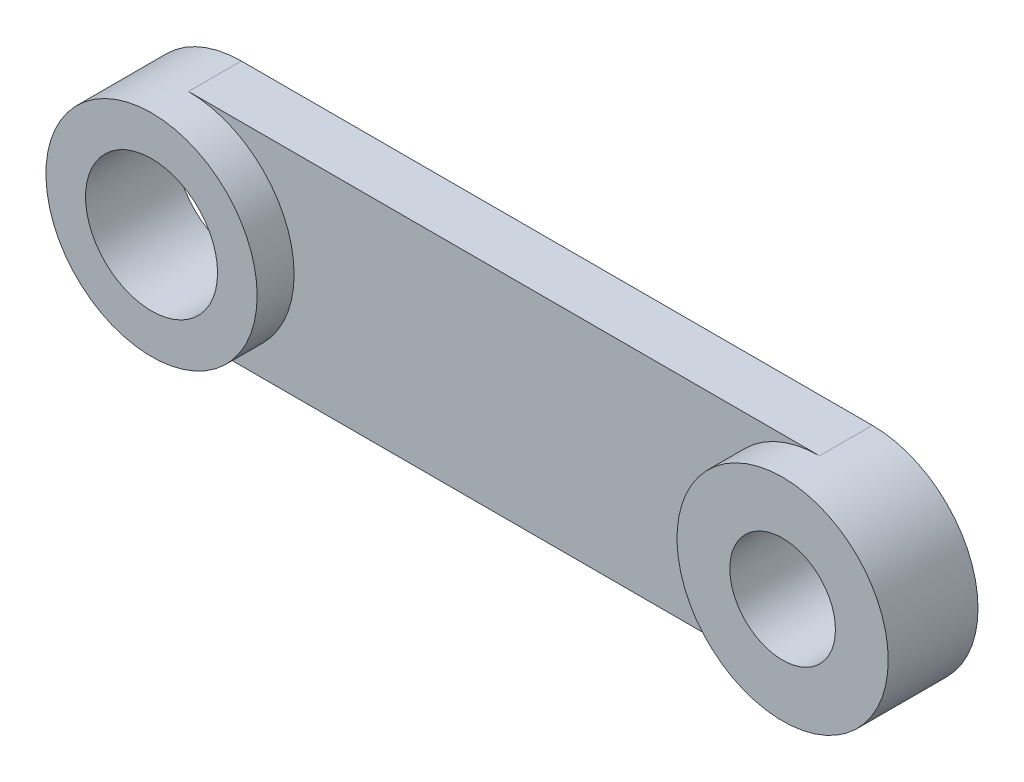
ISO-10303-21;
HEADER;
FILE_DESCRIPTION(('STEP AP214'),'2;1');
FILE_NAME('part.step','',(''),(''),'','','');
FILE_SCHEMA(('AUTOMOTIVE_DESIGN { 1 0 10303 214 1 1 1 1 }'));
ENDSEC;
DATA;
#1=APPLICATION_CONTEXT('core data for automotive mechanical design processes');
#2=APPLICATION_PROTOCOL_DEFINITION('international standard','automotive_design',2000,#1);
#3=PRODUCT_CONTEXT('',#1,'mechanical');
#4=PRODUCT('Part','Part','',(#3));
#5=PRODUCT_RELATED_PRODUCT_CATEGORY('part','',(#4));
#6=PRODUCT_DEFINITION_FORMATION('','',#4);
#7=PRODUCT_DEFINITION_CONTEXT('part definition',#1,'design');
#8=PRODUCT_DEFINITION('design','',#6,#7);
#9=PRODUCT_DEFINITION_SHAPE('','',#8);
#10=(LENGTH_UNIT() NAMED_UNIT(*) SI_UNIT(.MILLI.,.METRE.));
#11=(NAMED_UNIT(*) PLANE_ANGLE_UNIT() SI_UNIT($,.RADIAN.));
#12=(NAMED_UNIT(*) SI_UNIT($,.STERADIAN.) SOLID_ANGLE_UNIT());
#13=UNCERTAINTY_MEASURE_WITH_UNIT(LENGTH_MEASURE(1.E-05),#10,'distance_accuracy_value','');
#14=(GEOMETRIC_REPRESENTATION_CONTEXT(3) GLOBAL_UNCERTAINTY_ASSIGNED_CONTEXT((#13)) GLOBAL_UNIT_ASSIGNED_CONTEXT((#10,
#11,#12)) REPRESENTATION_CONTEXT('',''));
#15=CARTESIAN_POINT('',(0.,0.,0.));
#16=DIRECTION('',(0.,0.,1.));
#17=DIRECTION('',(1.,0.,0.));
#18=AXIS2_PLACEMENT_3D('',#15,#16,#17);
#19=CARTESIAN_POINT('',(-59.75,20.,10.));
#20=DIRECTION('',(0.,-1.,0.));
#21=DIRECTION('',(0.,0.,-1.));
#22=AXIS2_PLACEMENT_3D('',#19,#20,#21);
#23=PLANE('',#22);
#24=DIRECTION('',(-1.,0.,0.));
#25=VECTOR('',#24,1.);
#26=CARTESIAN_POINT('',(-59.75,20.,0.));
#27=LINE('',#26,#25);
#28=CARTESIAN_POINT('',(59.75,20.,0.));
#29=VERTEX_POINT('',#28);
#30=CARTESIAN_POINT('',(-59.75,20.,0.));
#31=VERTEX_POINT('',#30);
#32=EDGE_CURVE('E86',#29,#31,#27,.T.);
#33=ORIENTED_EDGE('',*,*,#32,.T.);
#34=DIRECTION('',(0.,0.,-1.));
#35=VECTOR('',#34,1.);
#36=CARTESIAN_POINT('',(-59.75,20.,10.));
#37=LINE('',#36,#35);
#38=CARTESIAN_POINT('',(-59.75,20.,10.));
#39=VERTEX_POINT('',#38);
#40=EDGE_CURVE('E48',#39,#31,#37,.T.);
#41=ORIENTED_EDGE('',*,*,#40,.F.);
#42=DIRECTION('',(-1.,0.,0.));
#43=VECTOR('',#42,1.);
#44=CARTESIAN_POINT('',(-59.75,20.,10.));
#45=LINE('',#44,#43);
#46=CARTESIAN_POINT('',(59.75,20.,10.));
#47=VERTEX_POINT('',#46);
#48=EDGE_CURVE('E85',#47,#39,#45,.T.);
#49=ORIENTED_EDGE('',*,*,#48,.F.);
#50=DIRECTION('',(0.,0.,-1.));
#51=VECTOR('',#50,1.);
#52=CARTESIAN_POINT('',(59.75,20.,10.));
#53=LINE('',#52,#51);
#54=EDGE_CURVE('E11',#47,#29,#53,.T.);
#55=ORIENTED_EDGE('',*,*,#54,.T.);
#56=EDGE_LOOP('',(#33,#41,#49,#55));
#57=FACE_BOUND('',#56,.T.);
#58=ADVANCED_FACE('F39',(#57),#23,.F.);
#59=CARTESIAN_POINT('',(-59.75,-20.,10.));
#60=DIRECTION('',(0.,1.,0.));
#61=DIRECTION('',(0.,0.,1.));
#62=AXIS2_PLACEMENT_3D('',#59,#60,#61);
#63=PLANE('',#62);
#64=DIRECTION('',(1.,0.,0.));
#65=VECTOR('',#64,1.);
#66=CARTESIAN_POINT('',(-59.75,-20.,0.));
#67=LINE('',#66,#65);
#68=CARTESIAN_POINT('',(-59.75,-20.,0.));
#69=VERTEX_POINT('',#68);
#70=CARTESIAN_POINT('',(59.75,-20.,0.));
#71=VERTEX_POINT('',#70);
#72=EDGE_CURVE('E76',#69,#71,#67,.T.);
#73=ORIENTED_EDGE('',*,*,#72,.T.);
#74=DIRECTION('',(0.,0.,-1.));
#75=VECTOR('',#74,1.);
#76=CARTESIAN_POINT('',(59.75,-20.,10.));
#77=LINE('',#76,#75);
#78=CARTESIAN_POINT('',(59.75,-20.,10.));
#79=VERTEX_POINT('',#78);
#80=EDGE_CURVE('E79',#79,#71,#77,.T.);
#81=ORIENTED_EDGE('',*,*,#80,.F.);
#82=DIRECTION('',(1.,0.,0.));
#83=VECTOR('',#82,1.);
#84=CARTESIAN_POINT('',(-59.75,-20.,10.));
#85=LINE('',#84,#83);
#86=CARTESIAN_POINT('',(-59.75,-20.,10.));
#87=VERTEX_POINT('',#86);
#88=EDGE_CURVE('E96',#87,#79,#85,.T.);
#89=ORIENTED_EDGE('',*,*,#88,.F.);
#90=DIRECTION('',(0.,0.,-1.));
#91=VECTOR('',#90,1.);
#92=CARTESIAN_POINT('',(-59.75,-20.,10.));
#93=LINE('',#92,#91);
#94=EDGE_CURVE('E73',#87,#69,#93,.T.);
#95=ORIENTED_EDGE('',*,*,#94,.T.);
#96=EDGE_LOOP('',(#73,#81,#89,#95));
#97=FACE_BOUND('',#96,.T.);
#98=ADVANCED_FACE('F78',(#97),#63,.F.);
#99=CARTESIAN_POINT('',(0.,0.,10.));
#100=DIRECTION('',(0.,0.,-1.));
#101=DIRECTION('',(-1.,0.,0.));
#102=AXIS2_PLACEMENT_3D('',#99,#100,#101);
#103=PLANE('',#102);
#104=CARTESIAN_POINT('',(-59.75,0.,10.));
#105=DIRECTION('',(0.,0.,-1.));
#106=DIRECTION('',(-1.,0.,0.));
#107=AXIS2_PLACEMENT_3D('',#104,#105,#106);
#108=CIRCLE('',#107,20.);
#109=EDGE_CURVE('E56',#87,#39,#108,.F.);
#110=ORIENTED_EDGE('',*,*,#109,.F.);
#111=ORIENTED_EDGE('',*,*,#88,.T.);
#112=CARTESIAN_POINT('',(59.75,0.,10.));
#113=DIRECTION('',(0.,0.,-1.));
#114=DIRECTION('',(-1.,0.,0.));
#115=AXIS2_PLACEMENT_3D('',#112,#113,#114);
#116=CIRCLE('',#115,20.);
#117=EDGE_CURVE('E94',#47,#79,#116,.F.);
#118=ORIENTED_EDGE('',*,*,#117,.F.);
#119=ORIENTED_EDGE('',*,*,#48,.T.);
#120=EDGE_LOOP('',(#110,#111,#118,#119));
#121=FACE_BOUND('',#120,.T.);
#122=ADVANCED_FACE('F170',(#121),#103,.F.);
#123=CARTESIAN_POINT('',(0.,0.,0.));
#124=DIRECTION('',(0.,0.,-1.));
#125=DIRECTION('',(-1.,0.,0.));
#126=AXIS2_PLACEMENT_3D('',#123,#124,#125);
#127=PLANE('',#126);
#128=CARTESIAN_POINT('',(-59.75,0.,0.));
#129=DIRECTION('',(0.,0.,1.));
#130=DIRECTION('',(1.,0.,0.));
#131=AXIS2_PLACEMENT_3D('',#128,#129,#130);
#132=CIRCLE('',#131,12.5);
#133=CARTESIAN_POINT('',(-47.25,0.,0.));
#134=VERTEX_POINT('',#133);
#135=EDGE_CURVE('E135',#134,#134,#132,.T.);
#136=ORIENTED_EDGE('',*,*,#135,.T.);
#137=EDGE_LOOP('',(#136));
#138=FACE_BOUND('',#137,.T.);
#139=CARTESIAN_POINT('',(59.75,0.,0.));
#140=DIRECTION('',(0.,0.,1.));
#141=DIRECTION('',(1.,0.,0.));
#142=AXIS2_PLACEMENT_3D('',#139,#140,#141);
#143=CIRCLE('',#142,10.);
#144=CARTESIAN_POINT('',(69.75,0.,0.));
#145=VERTEX_POINT('',#144);
#146=EDGE_CURVE('E138',#145,#145,#143,.T.);
#147=ORIENTED_EDGE('',*,*,#146,.T.);
#148=EDGE_LOOP('',(#147));
#149=FACE_BOUND('',#148,.T.);
#150=ORIENTED_EDGE('',*,*,#72,.F.);
#151=CARTESIAN_POINT('',(-59.75,0.,0.));
#152=DIRECTION('',(0.,0.,1.));
#153=DIRECTION('',(1.,0.,0.));
#154=AXIS2_PLACEMENT_3D('',#151,#152,#153);
#155=CIRCLE('',#154,20.);
#156=EDGE_CURVE('E123',#31,#69,#155,.T.);
#157=ORIENTED_EDGE('',*,*,#156,.F.);
#158=ORIENTED_EDGE('',*,*,#32,.F.);
#159=CARTESIAN_POINT('',(59.75,0.,0.));
#160=DIRECTION('',(0.,0.,1.));
#161=DIRECTION('',(1.,0.,0.));
#162=AXIS2_PLACEMENT_3D('',#159,#160,#161);
#163=CIRCLE('',#162,20.);
#164=EDGE_CURVE('E93',#71,#29,#163,.T.);
#165=ORIENTED_EDGE('',*,*,#164,.F.);
#166=EDGE_LOOP('',(#150,#157,#158,#165));
#167=FACE_BOUND('',#166,.T.);
#168=ADVANCED_FACE('F98',(#138,#149,#167),#127,.T.);
#169=CARTESIAN_POINT('',(59.75,0.,17.));
#170=DIRECTION('',(0.,0.,-1.));
#171=DIRECTION('',(-1.,0.,0.));
#172=AXIS2_PLACEMENT_3D('',#169,#170,#171);
#173=CYLINDRICAL_SURFACE('',#172,20.);
#174=CARTESIAN_POINT('',(59.75,0.,17.));
#175=DIRECTION('',(0.,0.,1.));
#176=DIRECTION('',(1.,0.,0.));
#177=AXIS2_PLACEMENT_3D('',#174,#175,#176);
#178=CIRCLE('',#177,20.);
#179=CARTESIAN_POINT('',(79.75,0.,17.));
#180=VERTEX_POINT('',#179);
#181=EDGE_CURVE('E100',#180,#180,#178,.T.);
#182=ORIENTED_EDGE('',*,*,#181,.F.);
#183=EDGE_LOOP('',(#182));
#184=FACE_BOUND('',#183,.T.);
#185=ORIENTED_EDGE('',*,*,#164,.T.);
#186=ORIENTED_EDGE('',*,*,#54,.F.);
#187=ORIENTED_EDGE('',*,*,#117,.T.);
#188=ORIENTED_EDGE('',*,*,#80,.T.);
#189=EDGE_LOOP('',(#185,#186,#187,#188));
#190=FACE_BOUND('',#189,.T.);
#191=ADVANCED_FACE('F91',(#184,#190),#173,.T.);
#192=CARTESIAN_POINT('',(59.75,0.,17.));
#193=DIRECTION('',(0.,0.,1.));
#194=DIRECTION('',(1.,0.,0.));
#195=AXIS2_PLACEMENT_3D('',#192,#193,#194);
#196=PLANE('',#195);
#197=CARTESIAN_POINT('',(59.75,0.,17.));
#198=DIRECTION('',(0.,0.,1.));
#199=DIRECTION('',(1.,0.,0.));
#200=AXIS2_PLACEMENT_3D('',#197,#198,#199);
#201=CIRCLE('',#200,10.);
#202=CARTESIAN_POINT('',(69.75,0.,17.));
#203=VERTEX_POINT('',#202);
#204=EDGE_CURVE('E142',#203,#203,#201,.T.);
#205=ORIENTED_EDGE('',*,*,#204,.F.);
#206=EDGE_LOOP('',(#205));
#207=FACE_BOUND('',#206,.T.);
#208=ORIENTED_EDGE('',*,*,#181,.T.);
#209=EDGE_LOOP('',(#208));
#210=FACE_BOUND('',#209,.T.);
#211=ADVANCED_FACE('F181',(#207,#210),#196,.T.);
#212=CARTESIAN_POINT('',(-59.75,0.,17.));
#213=DIRECTION('',(0.,0.,-1.));
#214=DIRECTION('',(-1.,0.,0.));
#215=AXIS2_PLACEMENT_3D('',#212,#213,#214);
#216=CYLINDRICAL_SURFACE('',#215,20.);
#217=CARTESIAN_POINT('',(-59.75,0.,17.));
#218=DIRECTION('',(0.,0.,1.));
#219=DIRECTION('',(1.,0.,0.));
#220=AXIS2_PLACEMENT_3D('',#217,#218,#219);
#221=CIRCLE('',#220,20.);
#222=CARTESIAN_POINT('',(-39.75,0.,17.));
#223=VERTEX_POINT('',#222);
#224=EDGE_CURVE('E106',#223,#223,#221,.T.);
#225=ORIENTED_EDGE('',*,*,#224,.F.);
#226=EDGE_LOOP('',(#225));
#227=FACE_BOUND('',#226,.T.);
#228=ORIENTED_EDGE('',*,*,#109,.T.);
#229=ORIENTED_EDGE('',*,*,#40,.T.);
#230=ORIENTED_EDGE('',*,*,#156,.T.);
#231=ORIENTED_EDGE('',*,*,#94,.F.);
#232=EDGE_LOOP('',(#228,#229,#230,#231));
#233=FACE_BOUND('',#232,.T.);
#234=ADVANCED_FACE('F122',(#227,#233),#216,.T.);
#235=CARTESIAN_POINT('',(-59.75,0.,17.));
#236=DIRECTION('',(0.,0.,1.));
#237=DIRECTION('',(1.,0.,0.));
#238=AXIS2_PLACEMENT_3D('',#235,#236,#237);
#239=PLANE('',#238);
#240=CARTESIAN_POINT('',(-59.75,0.,17.));
#241=DIRECTION('',(0.,0.,1.));
#242=DIRECTION('',(1.,0.,0.));
#243=AXIS2_PLACEMENT_3D('',#240,#241,#242);
#244=CIRCLE('',#243,12.5);
#245=CARTESIAN_POINT('',(-47.25,0.,17.));
#246=VERTEX_POINT('',#245);
#247=EDGE_CURVE('E128',#246,#246,#244,.T.);
#248=ORIENTED_EDGE('',*,*,#247,.F.);
#249=EDGE_LOOP('',(#248));
#250=FACE_BOUND('',#249,.T.);
#251=ORIENTED_EDGE('',*,*,#224,.T.);
#252=EDGE_LOOP('',(#251));
#253=FACE_BOUND('',#252,.T.);
#254=ADVANCED_FACE('F155',(#250,#253),#239,.T.);
#255=CARTESIAN_POINT('',(-59.75,0.,17.));
#256=DIRECTION('',(0.,0.,-1.));
#257=DIRECTION('',(-1.,0.,0.));
#258=AXIS2_PLACEMENT_3D('',#255,#256,#257);
#259=CYLINDRICAL_SURFACE('',#258,12.5);
#260=ORIENTED_EDGE('',*,*,#247,.T.);
#261=EDGE_LOOP('',(#260));
#262=FACE_BOUND('',#261,.T.);
#263=ORIENTED_EDGE('',*,*,#135,.F.);
#264=EDGE_LOOP('',(#263));
#265=FACE_BOUND('',#264,.T.);
#266=ADVANCED_FACE('F152',(#262,#265),#259,.F.);
#267=CARTESIAN_POINT('',(59.75,0.,17.));
#268=DIRECTION('',(0.,0.,-1.));
#269=DIRECTION('',(-1.,0.,0.));
#270=AXIS2_PLACEMENT_3D('',#267,#268,#269);
#271=CYLINDRICAL_SURFACE('',#270,10.);
#272=ORIENTED_EDGE('',*,*,#204,.T.);
#273=EDGE_LOOP('',(#272));
#274=FACE_BOUND('',#273,.T.);
#275=ORIENTED_EDGE('',*,*,#146,.F.);
#276=EDGE_LOOP('',(#275));
#277=FACE_BOUND('',#276,.T.);
#278=ADVANCED_FACE('F154',(#274,#277),#271,.F.);
#279=CLOSED_SHELL('',(#58,#98,#122,#168,#191,#211,#234,#254,#266,#278));
#280=MANIFOLD_SOLID_BREP('B2',#279);
#281=ADVANCED_BREP_SHAPE_REPRESENTATION('',(#18,#280),#14);
#282=SHAPE_DEFINITION_REPRESENTATION(#9,#281);
ENDSEC;
END-ISO-10303-21;
